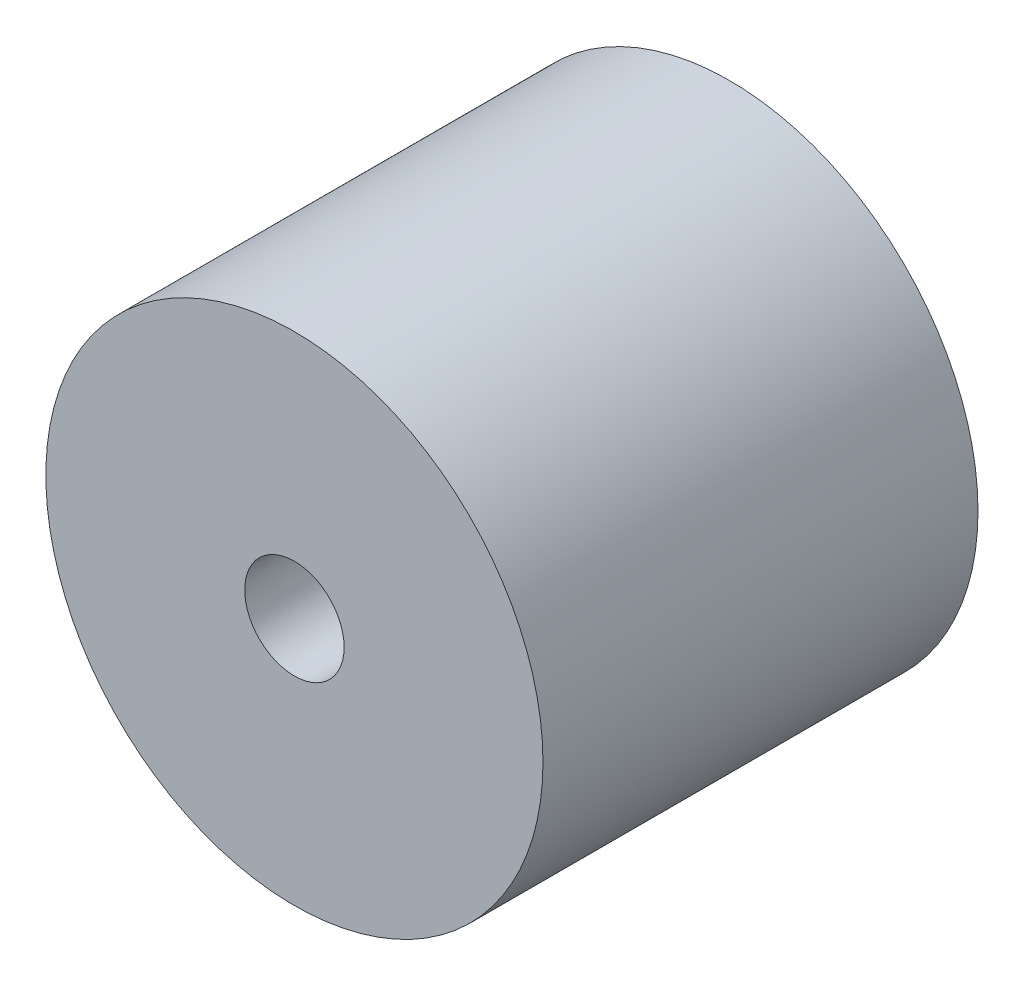
ISO-10303-21;
HEADER;
FILE_DESCRIPTION(('STEP AP214'),'2;1');
FILE_NAME('part.step','',(''),(''),'','','');
FILE_SCHEMA(('AUTOMOTIVE_DESIGN { 1 0 10303 214 1 1 1 1 }'));
ENDSEC;
DATA;
#1=APPLICATION_CONTEXT('core data for automotive mechanical design processes');
#2=APPLICATION_PROTOCOL_DEFINITION('international standard','automotive_design',2000,#1);
#3=PRODUCT_CONTEXT('',#1,'mechanical');
#4=PRODUCT('Part','Part','',(#3));
#5=PRODUCT_RELATED_PRODUCT_CATEGORY('part','',(#4));
#6=PRODUCT_DEFINITION_FORMATION('','',#4);
#7=PRODUCT_DEFINITION_CONTEXT('part definition',#1,'design');
#8=PRODUCT_DEFINITION('design','',#6,#7);
#9=PRODUCT_DEFINITION_SHAPE('','',#8);
#10=(LENGTH_UNIT() NAMED_UNIT(*) SI_UNIT(.MILLI.,.METRE.));
#11=(NAMED_UNIT(*) PLANE_ANGLE_UNIT() SI_UNIT($,.RADIAN.));
#12=(NAMED_UNIT(*) SI_UNIT($,.STERADIAN.) SOLID_ANGLE_UNIT());
#13=UNCERTAINTY_MEASURE_WITH_UNIT(LENGTH_MEASURE(1.E-05),#10,'distance_accuracy_value','');
#14=(GEOMETRIC_REPRESENTATION_CONTEXT(3) GLOBAL_UNCERTAINTY_ASSIGNED_CONTEXT((#13)) GLOBAL_UNIT_ASSIGNED_CONTEXT((#10,
#11,#12)) REPRESENTATION_CONTEXT('',''));
#15=CARTESIAN_POINT('',(0.,0.,0.));
#16=DIRECTION('',(0.,0.,1.));
#17=DIRECTION('',(1.,0.,0.));
#18=AXIS2_PLACEMENT_3D('',#15,#16,#17);
#19=CARTESIAN_POINT('',(0.,0.399999999999998,0.));
#20=DIRECTION('',(0.,0.,-1.));
#21=DIRECTION('',(-1.,0.,0.));
#22=AXIS2_PLACEMENT_3D('',#19,#20,#21);
#23=PLANE('',#22);
#24=CARTESIAN_POINT('',(0.,0.,0.));
#25=DIRECTION('',(0.,0.,1.));
#26=DIRECTION('',(1.,0.,0.));
#27=AXIS2_PLACEMENT_3D('',#24,#25,#26);
#28=CIRCLE('',#27,0.399999999999998);
#29=CARTESIAN_POINT('',(0.399999999999998,0.,0.));
#30=VERTEX_POINT('',#29);
#31=EDGE_CURVE('E45',#30,#30,#28,.T.);
#32=ORIENTED_EDGE('',*,*,#31,.F.);
#33=EDGE_LOOP('',(#32));
#34=FACE_BOUND('',#33,.T.);
#35=CARTESIAN_POINT('',(0.,0.,0.));
#36=DIRECTION('',(0.,0.,1.));
#37=DIRECTION('',(1.,0.,0.));
#38=AXIS2_PLACEMENT_3D('',#35,#36,#37);
#39=CIRCLE('',#38,2.);
#40=CARTESIAN_POINT('',(2.,0.,0.));
#41=VERTEX_POINT('',#40);
#42=EDGE_CURVE('E10',#41,#41,#39,.T.);
#43=ORIENTED_EDGE('',*,*,#42,.T.);
#44=EDGE_LOOP('',(#43));
#45=FACE_BOUND('',#44,.T.);
#46=ADVANCED_FACE('F31',(#34,#45),#23,.F.);
#47=CARTESIAN_POINT('',(0.,0.,110.940504921599));
#48=DIRECTION('',(0.,0.,1.));
#49=DIRECTION('',(1.,0.,0.));
#50=AXIS2_PLACEMENT_3D('',#47,#48,#49);
#51=CYLINDRICAL_SURFACE('',#50,2.);
#52=ORIENTED_EDGE('',*,*,#42,.F.);
#53=EDGE_LOOP('',(#52));
#54=FACE_BOUND('',#53,.T.);
#55=CARTESIAN_POINT('',(0.,0.,-3.5));
#56=DIRECTION('',(0.,0.,1.));
#57=DIRECTION('',(1.,0.,0.));
#58=AXIS2_PLACEMENT_3D('',#55,#56,#57);
#59=CIRCLE('',#58,2.);
#60=CARTESIAN_POINT('',(2.,0.,-3.5));
#61=VERTEX_POINT('',#60);
#62=EDGE_CURVE('E37',#61,#61,#59,.T.);
#63=ORIENTED_EDGE('',*,*,#62,.T.);
#64=EDGE_LOOP('',(#63));
#65=FACE_BOUND('',#64,.T.);
#66=ADVANCED_FACE('F54',(#54,#65),#51,.T.);
#67=CARTESIAN_POINT('',(0.,0.4,-3.5));
#68=DIRECTION('',(0.,0.,1.));
#69=DIRECTION('',(1.,0.,0.));
#70=AXIS2_PLACEMENT_3D('',#67,#68,#69);
#71=PLANE('',#70);
#72=ORIENTED_EDGE('',*,*,#62,.F.);
#73=EDGE_LOOP('',(#72));
#74=FACE_BOUND('',#73,.T.);
#75=CARTESIAN_POINT('',(0.,0.,-3.5));
#76=DIRECTION('',(0.,0.,1.));
#77=DIRECTION('',(1.,0.,0.));
#78=AXIS2_PLACEMENT_3D('',#75,#76,#77);
#79=CIRCLE('',#78,0.4);
#80=CARTESIAN_POINT('',(0.4,0.,-3.5));
#81=VERTEX_POINT('',#80);
#82=EDGE_CURVE('E41',#81,#81,#79,.T.);
#83=ORIENTED_EDGE('',*,*,#82,.T.);
#84=EDGE_LOOP('',(#83));
#85=FACE_BOUND('',#84,.T.);
#86=ADVANCED_FACE('F58',(#74,#85),#71,.F.);
#87=CARTESIAN_POINT('',(0.,0.,110.940504921599));
#88=DIRECTION('',(0.,0.,1.));
#89=DIRECTION('',(1.,0.,0.));
#90=AXIS2_PLACEMENT_3D('',#87,#88,#89);
#91=CYLINDRICAL_SURFACE('',#90,0.399999999999999);
#92=ORIENTED_EDGE('',*,*,#82,.F.);
#93=EDGE_LOOP('',(#92));
#94=FACE_BOUND('',#93,.T.);
#95=ORIENTED_EDGE('',*,*,#31,.T.);
#96=EDGE_LOOP('',(#95));
#97=FACE_BOUND('',#96,.T.);
#98=ADVANCED_FACE('F51',(#94,#97),#91,.F.);
#99=CLOSED_SHELL('',(#46,#66,#86,#98));
#100=MANIFOLD_SOLID_BREP('B2',#99);
#101=ADVANCED_BREP_SHAPE_REPRESENTATION('',(#18,#100),#14);
#102=SHAPE_DEFINITION_REPRESENTATION(#9,#101);
ENDSEC;
END-ISO-10303-21;
